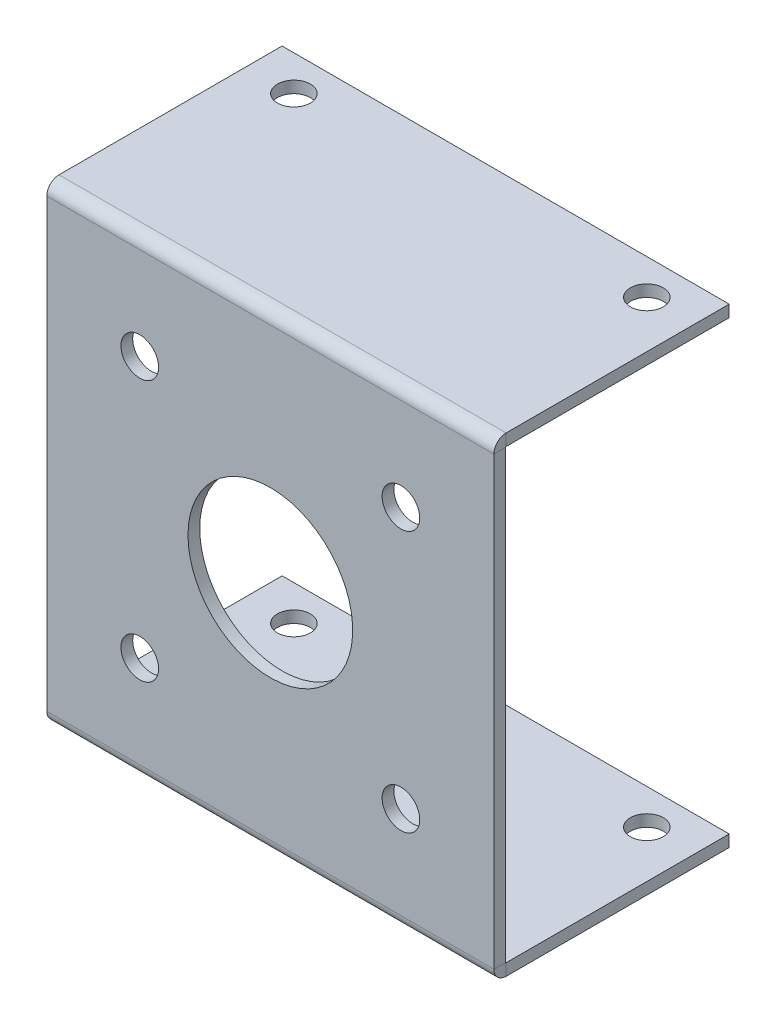
ISO-10303-21;
HEADER;
FILE_DESCRIPTION(('STEP AP214'),'2;1');
FILE_NAME('part.step','',(''),(''),'','','');
FILE_SCHEMA(('AUTOMOTIVE_DESIGN { 1 0 10303 214 1 1 1 1 }'));
ENDSEC;
DATA;
#1=APPLICATION_CONTEXT('core data for automotive mechanical design processes');
#2=APPLICATION_PROTOCOL_DEFINITION('international standard','automotive_design',2000,#1);
#3=PRODUCT_CONTEXT('',#1,'mechanical');
#4=PRODUCT('Part','Part','',(#3));
#5=PRODUCT_RELATED_PRODUCT_CATEGORY('part','',(#4));
#6=PRODUCT_DEFINITION_FORMATION('','',#4);
#7=PRODUCT_DEFINITION_CONTEXT('part definition',#1,'design');
#8=PRODUCT_DEFINITION('design','',#6,#7);
#9=PRODUCT_DEFINITION_SHAPE('','',#8);
#10=(LENGTH_UNIT() NAMED_UNIT(*) SI_UNIT(.MILLI.,.METRE.));
#11=(NAMED_UNIT(*) PLANE_ANGLE_UNIT() SI_UNIT($,.RADIAN.));
#12=(NAMED_UNIT(*) SI_UNIT($,.STERADIAN.) SOLID_ANGLE_UNIT());
#13=UNCERTAINTY_MEASURE_WITH_UNIT(LENGTH_MEASURE(1.E-05),#10,'distance_accuracy_value','');
#14=(GEOMETRIC_REPRESENTATION_CONTEXT(3) GLOBAL_UNCERTAINTY_ASSIGNED_CONTEXT((#13)) GLOBAL_UNIT_ASSIGNED_CONTEXT((#10,
#11,#12)) REPRESENTATION_CONTEXT('',''));
#15=CARTESIAN_POINT('',(0.,0.,0.));
#16=DIRECTION('',(0.,0.,1.));
#17=DIRECTION('',(1.,0.,0.));
#18=AXIS2_PLACEMENT_3D('',#15,#16,#17);
#19=CARTESIAN_POINT('',(0.,0.,-5.));
#20=DIRECTION('',(0.,0.,-1.));
#21=DIRECTION('',(-1.,0.,0.));
#22=AXIS2_PLACEMENT_3D('',#19,#20,#21);
#23=PLANE('',#22);
#24=CARTESIAN_POINT('',(55.5,-55.5,-5.));
#25=DIRECTION('',(0.,0.,-1.));
#26=DIRECTION('',(-1.,0.,0.));
#27=AXIS2_PLACEMENT_3D('',#24,#25,#26);
#28=CIRCLE('',#27,8.00000000000001);
#29=CARTESIAN_POINT('',(47.5,-55.5,-5.));
#30=VERTEX_POINT('',#29);
#31=EDGE_CURVE('E297',#30,#30,#28,.T.);
#32=ORIENTED_EDGE('',*,*,#31,.F.);
#33=EDGE_LOOP('',(#32));
#34=FACE_BOUND('',#33,.T.);
#35=CARTESIAN_POINT('',(-55.5,-55.5,-5.));
#36=DIRECTION('',(0.,0.,-1.));
#37=DIRECTION('',(-1.,0.,0.));
#38=AXIS2_PLACEMENT_3D('',#35,#36,#37);
#39=CIRCLE('',#38,8.);
#40=CARTESIAN_POINT('',(-63.5,-55.5,-5.));
#41=VERTEX_POINT('',#40);
#42=EDGE_CURVE('E310',#41,#41,#39,.T.);
#43=ORIENTED_EDGE('',*,*,#42,.F.);
#44=EDGE_LOOP('',(#43));
#45=FACE_BOUND('',#44,.T.);
#46=CARTESIAN_POINT('',(-55.5,55.5,-5.));
#47=DIRECTION('',(0.,0.,-1.));
#48=DIRECTION('',(-1.,0.,0.));
#49=AXIS2_PLACEMENT_3D('',#46,#47,#48);
#50=CIRCLE('',#49,8.);
#51=CARTESIAN_POINT('',(-63.5,55.5,-5.));
#52=VERTEX_POINT('',#51);
#53=EDGE_CURVE('E306',#52,#52,#50,.T.);
#54=ORIENTED_EDGE('',*,*,#53,.F.);
#55=EDGE_LOOP('',(#54));
#56=FACE_BOUND('',#55,.T.);
#57=CARTESIAN_POINT('',(55.5,55.5,-5.));
#58=DIRECTION('',(0.,0.,-1.));
#59=DIRECTION('',(-1.,0.,0.));
#60=AXIS2_PLACEMENT_3D('',#57,#58,#59);
#61=CIRCLE('',#60,8.00000000000001);
#62=CARTESIAN_POINT('',(47.5,55.5,-5.));
#63=VERTEX_POINT('',#62);
#64=EDGE_CURVE('E301',#63,#63,#61,.T.);
#65=ORIENTED_EDGE('',*,*,#64,.F.);
#66=EDGE_LOOP('',(#65));
#67=FACE_BOUND('',#66,.T.);
#68=CARTESIAN_POINT('',(0.,0.,-5.));
#69=DIRECTION('',(0.,0.,-1.));
#70=DIRECTION('',(-1.,0.,0.));
#71=AXIS2_PLACEMENT_3D('',#68,#69,#70);
#72=CIRCLE('',#71,35.);
#73=CARTESIAN_POINT('',(-35.,0.,-5.));
#74=VERTEX_POINT('',#73);
#75=EDGE_CURVE('E213',#74,#74,#72,.T.);
#76=ORIENTED_EDGE('',*,*,#75,.F.);
#77=EDGE_LOOP('',(#76));
#78=FACE_BOUND('',#77,.T.);
#79=DIRECTION('',(0.,1.,0.));
#80=VECTOR('',#79,1.);
#81=CARTESIAN_POINT('',(95.,-100.,-5.));
#82=LINE('',#81,#80);
#83=CARTESIAN_POINT('',(95.,-94.8,-5.00000000000001));
#84=VERTEX_POINT('',#83);
#85=CARTESIAN_POINT('',(95.,94.8,-5.));
#86=VERTEX_POINT('',#85);
#87=EDGE_CURVE('E88',#84,#86,#82,.T.);
#88=ORIENTED_EDGE('',*,*,#87,.F.);
#89=DIRECTION('',(-1.,0.,0.));
#90=VECTOR('',#89,1.);
#91=CARTESIAN_POINT('',(-95.,-94.8,-5.00000000000001));
#92=LINE('',#91,#90);
#93=CARTESIAN_POINT('',(-95.,-94.8,-5.00000000000001));
#94=VERTEX_POINT('',#93);
#95=EDGE_CURVE('E226',#94,#84,#92,.F.);
#96=ORIENTED_EDGE('',*,*,#95,.F.);
#97=DIRECTION('',(0.,-1.,0.));
#98=VECTOR('',#97,1.);
#99=CARTESIAN_POINT('',(-95.,-100.,-5.));
#100=LINE('',#99,#98);
#101=CARTESIAN_POINT('',(-95.,94.8,-5.));
#102=VERTEX_POINT('',#101);
#103=EDGE_CURVE('E13',#102,#94,#100,.T.);
#104=ORIENTED_EDGE('',*,*,#103,.F.);
#105=DIRECTION('',(1.,0.,0.));
#106=VECTOR('',#105,1.);
#107=CARTESIAN_POINT('',(95.,94.8,-5.00000000000001));
#108=LINE('',#107,#106);
#109=EDGE_CURVE('E282',#86,#102,#108,.F.);
#110=ORIENTED_EDGE('',*,*,#109,.F.);
#111=EDGE_LOOP('',(#88,#96,#104,#110));
#112=FACE_BOUND('',#111,.T.);
#113=ADVANCED_FACE('F79',(#34,#45,#56,#67,#78,#112),#23,.T.);
#114=CARTESIAN_POINT('',(0.,0.,0.));
#115=DIRECTION('',(0.,0.,-1.));
#116=DIRECTION('',(-1.,0.,0.));
#117=AXIS2_PLACEMENT_3D('',#114,#115,#116);
#118=PLANE('',#117);
#119=CARTESIAN_POINT('',(55.5,-55.5,0.));
#120=DIRECTION('',(0.,0.,-1.));
#121=DIRECTION('',(-1.,0.,0.));
#122=AXIS2_PLACEMENT_3D('',#119,#120,#121);
#123=CIRCLE('',#122,8.00000000000001);
#124=CARTESIAN_POINT('',(47.5,-55.5,0.));
#125=VERTEX_POINT('',#124);
#126=EDGE_CURVE('E311',#125,#125,#123,.T.);
#127=ORIENTED_EDGE('',*,*,#126,.T.);
#128=EDGE_LOOP('',(#127));
#129=FACE_BOUND('',#128,.T.);
#130=CARTESIAN_POINT('',(-55.5,-55.5,0.));
#131=DIRECTION('',(0.,0.,-1.));
#132=DIRECTION('',(-1.,0.,0.));
#133=AXIS2_PLACEMENT_3D('',#130,#131,#132);
#134=CIRCLE('',#133,8.);
#135=CARTESIAN_POINT('',(-63.5,-55.5,0.));
#136=VERTEX_POINT('',#135);
#137=EDGE_CURVE('E307',#136,#136,#134,.T.);
#138=ORIENTED_EDGE('',*,*,#137,.T.);
#139=EDGE_LOOP('',(#138));
#140=FACE_BOUND('',#139,.T.);
#141=CARTESIAN_POINT('',(-55.5,55.5,0.));
#142=DIRECTION('',(0.,0.,-1.));
#143=DIRECTION('',(-1.,0.,0.));
#144=AXIS2_PLACEMENT_3D('',#141,#142,#143);
#145=CIRCLE('',#144,8.);
#146=CARTESIAN_POINT('',(-63.5,55.5,0.));
#147=VERTEX_POINT('',#146);
#148=EDGE_CURVE('E303',#147,#147,#145,.T.);
#149=ORIENTED_EDGE('',*,*,#148,.T.);
#150=EDGE_LOOP('',(#149));
#151=FACE_BOUND('',#150,.T.);
#152=CARTESIAN_POINT('',(55.5,55.5,0.));
#153=DIRECTION('',(0.,0.,-1.));
#154=DIRECTION('',(-1.,0.,0.));
#155=AXIS2_PLACEMENT_3D('',#152,#153,#154);
#156=CIRCLE('',#155,8.00000000000001);
#157=CARTESIAN_POINT('',(47.5,55.5,0.));
#158=VERTEX_POINT('',#157);
#159=EDGE_CURVE('E298',#158,#158,#156,.T.);
#160=ORIENTED_EDGE('',*,*,#159,.T.);
#161=EDGE_LOOP('',(#160));
#162=FACE_BOUND('',#161,.T.);
#163=CARTESIAN_POINT('',(0.,0.,0.));
#164=DIRECTION('',(0.,0.,-1.));
#165=DIRECTION('',(-1.,0.,0.));
#166=AXIS2_PLACEMENT_3D('',#163,#164,#165);
#167=CIRCLE('',#166,35.);
#168=CARTESIAN_POINT('',(-35.,0.,0.));
#169=VERTEX_POINT('',#168);
#170=EDGE_CURVE('E294',#169,#169,#167,.T.);
#171=ORIENTED_EDGE('',*,*,#170,.T.);
#172=EDGE_LOOP('',(#171));
#173=FACE_BOUND('',#172,.T.);
#174=DIRECTION('',(-1.,0.,0.));
#175=VECTOR('',#174,1.);
#176=CARTESIAN_POINT('',(-95.,-94.8,0.));
#177=LINE('',#176,#175);
#178=CARTESIAN_POINT('',(-95.,-94.8,0.));
#179=VERTEX_POINT('',#178);
#180=CARTESIAN_POINT('',(95.,-94.8,0.));
#181=VERTEX_POINT('',#180);
#182=EDGE_CURVE('E214',#179,#181,#177,.F.);
#183=ORIENTED_EDGE('',*,*,#182,.T.);
#184=DIRECTION('',(0.,1.,0.));
#185=VECTOR('',#184,1.);
#186=CARTESIAN_POINT('',(95.,-100.,0.));
#187=LINE('',#186,#185);
#188=CARTESIAN_POINT('',(95.,94.8,0.));
#189=VERTEX_POINT('',#188);
#190=EDGE_CURVE('E288',#181,#189,#187,.T.);
#191=ORIENTED_EDGE('',*,*,#190,.T.);
#192=DIRECTION('',(1.,0.,0.));
#193=VECTOR('',#192,1.);
#194=CARTESIAN_POINT('',(95.,94.8,0.));
#195=LINE('',#194,#193);
#196=CARTESIAN_POINT('',(-95.,94.8,0.));
#197=VERTEX_POINT('',#196);
#198=EDGE_CURVE('E270',#189,#197,#195,.F.);
#199=ORIENTED_EDGE('',*,*,#198,.T.);
#200=DIRECTION('',(0.,-1.,0.));
#201=VECTOR('',#200,1.);
#202=CARTESIAN_POINT('',(-95.,-100.,0.));
#203=LINE('',#202,#201);
#204=EDGE_CURVE('E290',#197,#179,#203,.T.);
#205=ORIENTED_EDGE('',*,*,#204,.T.);
#206=EDGE_LOOP('',(#183,#191,#199,#205));
#207=FACE_BOUND('',#206,.T.);
#208=ADVANCED_FACE('F372',(#129,#140,#151,#162,#173,#207),#118,.F.);
#209=CARTESIAN_POINT('',(-95.,-100.,-5.));
#210=DIRECTION('',(-1.,0.,0.));
#211=DIRECTION('',(0.,0.,1.));
#212=AXIS2_PLACEMENT_3D('',#209,#210,#211);
#213=PLANE('',#212);
#214=ORIENTED_EDGE('',*,*,#103,.T.);
#215=DIRECTION('',(0.,0.,1.));
#216=VECTOR('',#215,1.);
#217=CARTESIAN_POINT('',(-95.,-94.8,-5.00000000000001));
#218=LINE('',#217,#216);
#219=EDGE_CURVE('E220',#94,#179,#218,.T.);
#220=ORIENTED_EDGE('',*,*,#219,.T.);
#221=ORIENTED_EDGE('',*,*,#204,.F.);
#222=DIRECTION('',(0.,0.,1.));
#223=VECTOR('',#222,1.);
#224=CARTESIAN_POINT('',(-95.,94.8,-5.00000000000001));
#225=LINE('',#224,#223);
#226=EDGE_CURVE('E95',#102,#197,#225,.T.);
#227=ORIENTED_EDGE('',*,*,#226,.F.);
#228=EDGE_LOOP('',(#214,#220,#221,#227));
#229=FACE_BOUND('',#228,.T.);
#230=ADVANCED_FACE('F378',(#229),#213,.T.);
#231=CARTESIAN_POINT('',(95.,-100.,-5.));
#232=DIRECTION('',(1.,0.,0.));
#233=DIRECTION('',(0.,0.,-1.));
#234=AXIS2_PLACEMENT_3D('',#231,#232,#233);
#235=PLANE('',#234);
#236=DIRECTION('',(0.,0.,1.));
#237=VECTOR('',#236,1.);
#238=CARTESIAN_POINT('',(95.,-94.8,-5.00000000000001));
#239=LINE('',#238,#237);
#240=EDGE_CURVE('E232',#84,#181,#239,.T.);
#241=ORIENTED_EDGE('',*,*,#240,.F.);
#242=ORIENTED_EDGE('',*,*,#87,.T.);
#243=DIRECTION('',(0.,0.,1.));
#244=VECTOR('',#243,1.);
#245=CARTESIAN_POINT('',(95.,94.8,-5.00000000000001));
#246=LINE('',#245,#244);
#247=EDGE_CURVE('E276',#86,#189,#246,.T.);
#248=ORIENTED_EDGE('',*,*,#247,.T.);
#249=ORIENTED_EDGE('',*,*,#190,.F.);
#250=EDGE_LOOP('',(#241,#242,#248,#249));
#251=FACE_BOUND('',#250,.T.);
#252=ADVANCED_FACE('F81',(#251),#235,.T.);
#253=CARTESIAN_POINT('',(-95.,94.8,-5.20000000000001));
#254=DIRECTION('',(-1.,0.,0.));
#255=DIRECTION('',(0.,0.,1.));
#256=AXIS2_PLACEMENT_3D('',#253,#254,#255);
#257=PLANE('',#256);
#258=DIRECTION('',(0.,1.,0.));
#259=VECTOR('',#258,1.);
#260=CARTESIAN_POINT('',(-95.,100.,-5.2));
#261=LINE('',#260,#259);
#262=CARTESIAN_POINT('',(-95.,95.,-5.20000000000001));
#263=VERTEX_POINT('',#262);
#264=CARTESIAN_POINT('',(-95.,100.,-5.19999999999999));
#265=VERTEX_POINT('',#264);
#266=EDGE_CURVE('E235',#263,#265,#261,.T.);
#267=ORIENTED_EDGE('',*,*,#266,.F.);
#268=CARTESIAN_POINT('',(-95.,94.8,-5.20000000000001));
#269=DIRECTION('',(1.,0.,0.));
#270=DIRECTION('',(0.,0.,-1.));
#271=AXIS2_PLACEMENT_3D('',#268,#269,#270);
#272=CIRCLE('',#271,0.200000000000006);
#273=EDGE_CURVE('E279',#102,#263,#272,.F.);
#274=ORIENTED_EDGE('',*,*,#273,.F.);
#275=ORIENTED_EDGE('',*,*,#226,.T.);
#276=CARTESIAN_POINT('',(-95.,94.8,-5.20000000000001));
#277=DIRECTION('',(1.,0.,0.));
#278=DIRECTION('',(0.,0.,-1.));
#279=AXIS2_PLACEMENT_3D('',#276,#277,#278);
#280=CIRCLE('',#279,5.20000000000001);
#281=EDGE_CURVE('E272',#197,#265,#280,.F.);
#282=ORIENTED_EDGE('',*,*,#281,.T.);
#283=EDGE_LOOP('',(#267,#274,#275,#282));
#284=FACE_BOUND('',#283,.T.);
#285=ADVANCED_FACE('F390',(#284),#257,.T.);
#286=CARTESIAN_POINT('',(95.,94.8,-5.20000000000001));
#287=DIRECTION('',(-1.,0.,0.));
#288=DIRECTION('',(0.,0.,1.));
#289=AXIS2_PLACEMENT_3D('',#286,#287,#288);
#290=PLANE('',#289);
#291=CARTESIAN_POINT('',(95.,94.8,-5.20000000000001));
#292=DIRECTION('',(1.,0.,0.));
#293=DIRECTION('',(0.,0.,-1.));
#294=AXIS2_PLACEMENT_3D('',#291,#292,#293);
#295=CIRCLE('',#294,0.200000000000006);
#296=CARTESIAN_POINT('',(95.,95.,-5.20000000000001));
#297=VERTEX_POINT('',#296);
#298=EDGE_CURVE('E240',#297,#86,#295,.T.);
#299=ORIENTED_EDGE('',*,*,#298,.F.);
#300=DIRECTION('',(0.,1.,0.));
#301=VECTOR('',#300,1.);
#302=CARTESIAN_POINT('',(95.,95.,-5.20000000000001));
#303=LINE('',#302,#301);
#304=CARTESIAN_POINT('',(95.,100.,-5.19999999999999));
#305=VERTEX_POINT('',#304);
#306=EDGE_CURVE('E263',#297,#305,#303,.T.);
#307=ORIENTED_EDGE('',*,*,#306,.T.);
#308=CARTESIAN_POINT('',(95.,94.8,-5.20000000000001));
#309=DIRECTION('',(1.,0.,0.));
#310=DIRECTION('',(0.,0.,-1.));
#311=AXIS2_PLACEMENT_3D('',#308,#309,#310);
#312=CIRCLE('',#311,5.20000000000001);
#313=EDGE_CURVE('E273',#305,#189,#312,.T.);
#314=ORIENTED_EDGE('',*,*,#313,.T.);
#315=ORIENTED_EDGE('',*,*,#247,.F.);
#316=EDGE_LOOP('',(#299,#307,#314,#315));
#317=FACE_BOUND('',#316,.T.);
#318=ADVANCED_FACE('F384',(#317),#290,.F.);
#319=CARTESIAN_POINT('',(95.,94.8,-5.20000000000001));
#320=DIRECTION('',(1.,0.,0.));
#321=DIRECTION('',(0.,1.,0.));
#322=AXIS2_PLACEMENT_3D('',#319,#320,#321);
#323=CYLINDRICAL_SURFACE('',#322,5.20000000000001);
#324=ORIENTED_EDGE('',*,*,#198,.F.);
#325=ORIENTED_EDGE('',*,*,#313,.F.);
#326=DIRECTION('',(1.,0.,0.));
#327=VECTOR('',#326,1.);
#328=CARTESIAN_POINT('',(0.,100.,-5.19999999999999));
#329=LINE('',#328,#327);
#330=EDGE_CURVE('E260',#265,#305,#329,.T.);
#331=ORIENTED_EDGE('',*,*,#330,.F.);
#332=ORIENTED_EDGE('',*,*,#281,.F.);
#333=EDGE_LOOP('',(#324,#325,#331,#332));
#334=FACE_BOUND('',#333,.T.);
#335=ADVANCED_FACE('F423',(#334),#323,.T.);
#336=CARTESIAN_POINT('',(95.,94.8,-5.20000000000001));
#337=DIRECTION('',(1.,0.,0.));
#338=DIRECTION('',(0.,1.,0.));
#339=AXIS2_PLACEMENT_3D('',#336,#337,#338);
#340=CYLINDRICAL_SURFACE('',#339,0.200000000000006);
#341=ORIENTED_EDGE('',*,*,#109,.T.);
#342=ORIENTED_EDGE('',*,*,#273,.T.);
#343=DIRECTION('',(-1.,0.,0.));
#344=VECTOR('',#343,1.);
#345=CARTESIAN_POINT('',(-95.,95.,-5.20000000000001));
#346=LINE('',#345,#344);
#347=EDGE_CURVE('E266',#263,#297,#346,.F.);
#348=ORIENTED_EDGE('',*,*,#347,.T.);
#349=ORIENTED_EDGE('',*,*,#298,.T.);
#350=EDGE_LOOP('',(#341,#342,#348,#349));
#351=FACE_BOUND('',#350,.T.);
#352=ADVANCED_FACE('F396',(#351),#340,.F.);
#353=CARTESIAN_POINT('',(95.,100.,-4.99999999999998));
#354=DIRECTION('',(1.,0.,0.));
#355=DIRECTION('',(0.,0.,-1.));
#356=AXIS2_PLACEMENT_3D('',#353,#354,#355);
#357=PLANE('',#356);
#358=DIRECTION('',(0.,0.,1.));
#359=VECTOR('',#358,1.);
#360=CARTESIAN_POINT('',(95.,100.,-4.99999999999998));
#361=LINE('',#360,#359);
#362=CARTESIAN_POINT('',(95.,100.,-100.));
#363=VERTEX_POINT('',#362);
#364=EDGE_CURVE('E244',#363,#305,#361,.T.);
#365=ORIENTED_EDGE('',*,*,#364,.T.);
#366=ORIENTED_EDGE('',*,*,#306,.F.);
#367=DIRECTION('',(0.,0.,-1.));
#368=VECTOR('',#367,1.);
#369=CARTESIAN_POINT('',(95.,95.,3.5059674461847E-13));
#370=LINE('',#369,#368);
#371=CARTESIAN_POINT('',(95.,95.0000000000003,-100.));
#372=VERTEX_POINT('',#371);
#373=EDGE_CURVE('E252',#372,#297,#370,.F.);
#374=ORIENTED_EDGE('',*,*,#373,.F.);
#375=DIRECTION('',(0.,-1.,0.));
#376=VECTOR('',#375,1.);
#377=CARTESIAN_POINT('',(95.,100.,-100.));
#378=LINE('',#377,#376);
#379=EDGE_CURVE('E238',#363,#372,#378,.T.);
#380=ORIENTED_EDGE('',*,*,#379,.F.);
#381=EDGE_LOOP('',(#365,#366,#374,#380));
#382=FACE_BOUND('',#381,.T.);
#383=ADVANCED_FACE('F418',(#382),#357,.T.);
#384=CARTESIAN_POINT('',(-95.,100.,-100.));
#385=DIRECTION('',(-1.,0.,0.));
#386=DIRECTION('',(0.,0.,1.));
#387=AXIS2_PLACEMENT_3D('',#384,#385,#386);
#388=PLANE('',#387);
#389=DIRECTION('',(0.,0.,1.));
#390=VECTOR('',#389,1.);
#391=CARTESIAN_POINT('',(-95.,95.,3.5059674461847E-13));
#392=LINE('',#391,#390);
#393=CARTESIAN_POINT('',(-95.,95.0000000000003,-100.));
#394=VERTEX_POINT('',#393);
#395=EDGE_CURVE('E258',#263,#394,#392,.F.);
#396=ORIENTED_EDGE('',*,*,#395,.F.);
#397=ORIENTED_EDGE('',*,*,#266,.T.);
#398=DIRECTION('',(0.,0.,-1.));
#399=VECTOR('',#398,1.);
#400=CARTESIAN_POINT('',(-95.,100.,-100.));
#401=LINE('',#400,#399);
#402=CARTESIAN_POINT('',(-95.,100.,-100.));
#403=VERTEX_POINT('',#402);
#404=EDGE_CURVE('E250',#265,#403,#401,.T.);
#405=ORIENTED_EDGE('',*,*,#404,.T.);
#406=DIRECTION('',(0.,-1.,0.));
#407=VECTOR('',#406,1.);
#408=CARTESIAN_POINT('',(-95.,100.,-100.));
#409=LINE('',#408,#407);
#410=EDGE_CURVE('E241',#403,#394,#409,.T.);
#411=ORIENTED_EDGE('',*,*,#410,.T.);
#412=EDGE_LOOP('',(#396,#397,#405,#411));
#413=FACE_BOUND('',#412,.T.);
#414=ADVANCED_FACE('F404',(#413),#388,.T.);
#415=CARTESIAN_POINT('',(0.,100.,3.68054151312686E-13));
#416=DIRECTION('',(0.,1.,0.));
#417=DIRECTION('',(0.,0.,1.));
#418=AXIS2_PLACEMENT_3D('',#415,#416,#417);
#419=PLANE('',#418);
#420=CARTESIAN_POINT('',(-75.,100.,-85.0000000000007));
#421=DIRECTION('',(0.,-1.,0.));
#422=DIRECTION('',(0.,0.,-1.));
#423=AXIS2_PLACEMENT_3D('',#420,#421,#422);
#424=CIRCLE('',#423,7.);
#425=CARTESIAN_POINT('',(-75.,100.,-92.0000000000007));
#426=VERTEX_POINT('',#425);
#427=EDGE_CURVE('E316',#426,#426,#424,.T.);
#428=ORIENTED_EDGE('',*,*,#427,.T.);
#429=EDGE_LOOP('',(#428));
#430=FACE_BOUND('',#429,.T.);
#431=CARTESIAN_POINT('',(75.,100.,-85.0000000000007));
#432=DIRECTION('',(0.,-1.,0.));
#433=DIRECTION('',(0.,0.,-1.));
#434=AXIS2_PLACEMENT_3D('',#431,#432,#433);
#435=CIRCLE('',#434,7.);
#436=CARTESIAN_POINT('',(75.,100.,-92.0000000000007));
#437=VERTEX_POINT('',#436);
#438=EDGE_CURVE('E323',#437,#437,#435,.T.);
#439=ORIENTED_EDGE('',*,*,#438,.T.);
#440=EDGE_LOOP('',(#439));
#441=FACE_BOUND('',#440,.T.);
#442=ORIENTED_EDGE('',*,*,#404,.F.);
#443=ORIENTED_EDGE('',*,*,#330,.T.);
#444=ORIENTED_EDGE('',*,*,#364,.F.);
#445=DIRECTION('',(1.,0.,0.));
#446=VECTOR('',#445,1.);
#447=CARTESIAN_POINT('',(95.,100.,-100.));
#448=LINE('',#447,#446);
#449=EDGE_CURVE('E247',#403,#363,#448,.T.);
#450=ORIENTED_EDGE('',*,*,#449,.F.);
#451=EDGE_LOOP('',(#442,#443,#444,#450));
#452=FACE_BOUND('',#451,.T.);
#453=ADVANCED_FACE('F408',(#430,#441,#452),#419,.T.);
#454=CARTESIAN_POINT('',(0.,95.,3.5059674461847E-13));
#455=DIRECTION('',(0.,1.,0.));
#456=DIRECTION('',(0.,0.,1.));
#457=AXIS2_PLACEMENT_3D('',#454,#455,#456);
#458=PLANE('',#457);
#459=CARTESIAN_POINT('',(-75.,95.0000000000003,-85.0000000000007));
#460=DIRECTION('',(0.,1.,0.));
#461=DIRECTION('',(0.,0.,1.));
#462=AXIS2_PLACEMENT_3D('',#459,#460,#461);
#463=CIRCLE('',#462,7.);
#464=CARTESIAN_POINT('',(-75.,95.0000000000003,-78.0000000000007));
#465=VERTEX_POINT('',#464);
#466=EDGE_CURVE('E302',#465,#465,#463,.T.);
#467=ORIENTED_EDGE('',*,*,#466,.T.);
#468=EDGE_LOOP('',(#467));
#469=FACE_BOUND('',#468,.T.);
#470=CARTESIAN_POINT('',(75.,95.0000000000003,-85.0000000000007));
#471=DIRECTION('',(0.,1.,0.));
#472=DIRECTION('',(0.,0.,1.));
#473=AXIS2_PLACEMENT_3D('',#470,#471,#472);
#474=CIRCLE('',#473,7.);
#475=CARTESIAN_POINT('',(75.,95.0000000000003,-78.0000000000007));
#476=VERTEX_POINT('',#475);
#477=EDGE_CURVE('E320',#476,#476,#474,.T.);
#478=ORIENTED_EDGE('',*,*,#477,.T.);
#479=EDGE_LOOP('',(#478));
#480=FACE_BOUND('',#479,.T.);
#481=ORIENTED_EDGE('',*,*,#347,.F.);
#482=ORIENTED_EDGE('',*,*,#395,.T.);
#483=DIRECTION('',(-1.,0.,0.));
#484=VECTOR('',#483,1.);
#485=CARTESIAN_POINT('',(0.,95.0000000000003,-100.));
#486=LINE('',#485,#484);
#487=EDGE_CURVE('E255',#394,#372,#486,.F.);
#488=ORIENTED_EDGE('',*,*,#487,.T.);
#489=ORIENTED_EDGE('',*,*,#373,.T.);
#490=EDGE_LOOP('',(#481,#482,#488,#489));
#491=FACE_BOUND('',#490,.T.);
#492=ADVANCED_FACE('F415',(#469,#480,#491),#458,.F.);
#493=CARTESIAN_POINT('',(95.,100.,-100.));
#494=DIRECTION('',(0.,0.,-1.));
#495=DIRECTION('',(0.,1.,0.));
#496=AXIS2_PLACEMENT_3D('',#493,#494,#495);
#497=PLANE('',#496);
#498=ORIENTED_EDGE('',*,*,#487,.F.);
#499=ORIENTED_EDGE('',*,*,#410,.F.);
#500=ORIENTED_EDGE('',*,*,#449,.T.);
#501=ORIENTED_EDGE('',*,*,#379,.T.);
#502=EDGE_LOOP('',(#498,#499,#500,#501));
#503=FACE_BOUND('',#502,.T.);
#504=ADVANCED_FACE('F412',(#503),#497,.T.);
#505=CARTESIAN_POINT('',(95.,-94.8,-5.20000000000001));
#506=DIRECTION('',(1.,0.,0.));
#507=DIRECTION('',(0.,0.,-1.));
#508=AXIS2_PLACEMENT_3D('',#505,#506,#507);
#509=PLANE('',#508);
#510=DIRECTION('',(0.,1.,0.));
#511=VECTOR('',#510,1.);
#512=CARTESIAN_POINT('',(95.,-100.,-5.19999999999999));
#513=LINE('',#512,#511);
#514=CARTESIAN_POINT('',(95.,-95.,-5.20000000000001));
#515=VERTEX_POINT('',#514);
#516=CARTESIAN_POINT('',(95.,-100.,-5.19999999999999));
#517=VERTEX_POINT('',#516);
#518=EDGE_CURVE('E195',#515,#517,#513,.F.);
#519=ORIENTED_EDGE('',*,*,#518,.F.);
#520=CARTESIAN_POINT('',(95.,-94.8,-5.20000000000001));
#521=DIRECTION('',(-1.,0.,0.));
#522=DIRECTION('',(0.,0.,1.));
#523=AXIS2_PLACEMENT_3D('',#520,#521,#522);
#524=CIRCLE('',#523,0.200000000000006);
#525=EDGE_CURVE('E223',#84,#515,#524,.F.);
#526=ORIENTED_EDGE('',*,*,#525,.F.);
#527=ORIENTED_EDGE('',*,*,#240,.T.);
#528=CARTESIAN_POINT('',(95.,-94.8,-5.20000000000001));
#529=DIRECTION('',(-1.,0.,0.));
#530=DIRECTION('',(0.,0.,1.));
#531=AXIS2_PLACEMENT_3D('',#528,#529,#530);
#532=CIRCLE('',#531,5.20000000000001);
#533=EDGE_CURVE('E216',#181,#517,#532,.F.);
#534=ORIENTED_EDGE('',*,*,#533,.T.);
#535=EDGE_LOOP('',(#519,#526,#527,#534));
#536=FACE_BOUND('',#535,.T.);
#537=ADVANCED_FACE('F428',(#536),#509,.T.);
#538=CARTESIAN_POINT('',(-95.,-94.8,-5.20000000000001));
#539=DIRECTION('',(1.,0.,0.));
#540=DIRECTION('',(0.,0.,-1.));
#541=AXIS2_PLACEMENT_3D('',#538,#539,#540);
#542=PLANE('',#541);
#543=CARTESIAN_POINT('',(-95.,-94.8,-5.20000000000001));
#544=DIRECTION('',(-1.,0.,0.));
#545=DIRECTION('',(0.,0.,1.));
#546=AXIS2_PLACEMENT_3D('',#543,#544,#545);
#547=CIRCLE('',#546,0.200000000000006);
#548=CARTESIAN_POINT('',(-95.,-95.,-5.20000000000001));
#549=VERTEX_POINT('',#548);
#550=EDGE_CURVE('E229',#549,#94,#547,.T.);
#551=ORIENTED_EDGE('',*,*,#550,.F.);
#552=DIRECTION('',(0.,1.,0.));
#553=VECTOR('',#552,1.);
#554=CARTESIAN_POINT('',(-95.,-95.,-5.20000000000001));
#555=LINE('',#554,#553);
#556=CARTESIAN_POINT('',(-95.,-100.,-5.19999999999999));
#557=VERTEX_POINT('',#556);
#558=EDGE_CURVE('E207',#549,#557,#555,.F.);
#559=ORIENTED_EDGE('',*,*,#558,.T.);
#560=CARTESIAN_POINT('',(-95.,-94.8,-5.20000000000001));
#561=DIRECTION('',(-1.,0.,0.));
#562=DIRECTION('',(0.,0.,1.));
#563=AXIS2_PLACEMENT_3D('',#560,#561,#562);
#564=CIRCLE('',#563,5.20000000000001);
#565=EDGE_CURVE('E217',#557,#179,#564,.T.);
#566=ORIENTED_EDGE('',*,*,#565,.T.);
#567=ORIENTED_EDGE('',*,*,#219,.F.);
#568=EDGE_LOOP('',(#551,#559,#566,#567));
#569=FACE_BOUND('',#568,.T.);
#570=ADVANCED_FACE('F358',(#569),#542,.F.);
#571=CARTESIAN_POINT('',(-95.,-94.8,-5.20000000000001));
#572=DIRECTION('',(-1.,0.,0.));
#573=DIRECTION('',(0.,-1.,0.));
#574=AXIS2_PLACEMENT_3D('',#571,#572,#573);
#575=CYLINDRICAL_SURFACE('',#574,5.20000000000001);
#576=ORIENTED_EDGE('',*,*,#182,.F.);
#577=ORIENTED_EDGE('',*,*,#565,.F.);
#578=DIRECTION('',(-1.,0.,0.));
#579=VECTOR('',#578,1.);
#580=CARTESIAN_POINT('',(95.,-100.,-5.19999999999999));
#581=LINE('',#580,#579);
#582=EDGE_CURVE('E205',#557,#517,#581,.F.);
#583=ORIENTED_EDGE('',*,*,#582,.T.);
#584=ORIENTED_EDGE('',*,*,#533,.F.);
#585=EDGE_LOOP('',(#576,#577,#583,#584));
#586=FACE_BOUND('',#585,.T.);
#587=ADVANCED_FACE('F367',(#586),#575,.T.);
#588=CARTESIAN_POINT('',(-95.,-94.8,-5.20000000000001));
#589=DIRECTION('',(-1.,0.,0.));
#590=DIRECTION('',(0.,-1.,0.));
#591=AXIS2_PLACEMENT_3D('',#588,#589,#590);
#592=CYLINDRICAL_SURFACE('',#591,0.200000000000006);
#593=ORIENTED_EDGE('',*,*,#95,.T.);
#594=ORIENTED_EDGE('',*,*,#525,.T.);
#595=DIRECTION('',(-1.,0.,0.));
#596=VECTOR('',#595,1.);
#597=CARTESIAN_POINT('',(95.,-95.,-5.20000000000001));
#598=LINE('',#597,#596);
#599=EDGE_CURVE('E210',#515,#549,#598,.T.);
#600=ORIENTED_EDGE('',*,*,#599,.T.);
#601=ORIENTED_EDGE('',*,*,#550,.T.);
#602=EDGE_LOOP('',(#593,#594,#600,#601));
#603=FACE_BOUND('',#602,.T.);
#604=ADVANCED_FACE('F353',(#603),#592,.F.);
#605=CARTESIAN_POINT('',(-95.,-100.,-100.));
#606=DIRECTION('',(1.,0.,0.));
#607=DIRECTION('',(0.,0.,-1.));
#608=AXIS2_PLACEMENT_3D('',#605,#606,#607);
#609=PLANE('',#608);
#610=ORIENTED_EDGE('',*,*,#558,.F.);
#611=DIRECTION('',(0.,0.,1.));
#612=VECTOR('',#611,1.);
#613=CARTESIAN_POINT('',(-95.,-95.0000000000003,-100.));
#614=LINE('',#613,#612);
#615=CARTESIAN_POINT('',(-95.,-95.0000000000003,-100.));
#616=VERTEX_POINT('',#615);
#617=EDGE_CURVE('E203',#549,#616,#614,.F.);
#618=ORIENTED_EDGE('',*,*,#617,.T.);
#619=DIRECTION('',(0.,1.,0.));
#620=VECTOR('',#619,1.);
#621=CARTESIAN_POINT('',(-95.,-100.,-100.));
#622=LINE('',#621,#620);
#623=CARTESIAN_POINT('',(-95.,-100.,-100.));
#624=VERTEX_POINT('',#623);
#625=EDGE_CURVE('E191',#624,#616,#622,.T.);
#626=ORIENTED_EDGE('',*,*,#625,.F.);
#627=DIRECTION('',(0.,0.,-1.));
#628=VECTOR('',#627,1.);
#629=CARTESIAN_POINT('',(-95.,-100.,3.68054151312686E-13));
#630=LINE('',#629,#628);
#631=EDGE_CURVE('E178',#557,#624,#630,.T.);
#632=ORIENTED_EDGE('',*,*,#631,.F.);
#633=EDGE_LOOP('',(#610,#618,#626,#632));
#634=FACE_BOUND('',#633,.T.);
#635=ADVANCED_FACE('F359',(#634),#609,.F.);
#636=CARTESIAN_POINT('',(95.,-100.,-4.99999999999998));
#637=DIRECTION('',(-1.,0.,0.));
#638=DIRECTION('',(0.,0.,1.));
#639=AXIS2_PLACEMENT_3D('',#636,#637,#638);
#640=PLANE('',#639);
#641=ORIENTED_EDGE('',*,*,#518,.T.);
#642=DIRECTION('',(0.,0.,1.));
#643=VECTOR('',#642,1.);
#644=CARTESIAN_POINT('',(95.,-100.,3.68054151312686E-13));
#645=LINE('',#644,#643);
#646=CARTESIAN_POINT('',(95.,-100.,-100.));
#647=VERTEX_POINT('',#646);
#648=EDGE_CURVE('E176',#647,#517,#645,.T.);
#649=ORIENTED_EDGE('',*,*,#648,.F.);
#650=DIRECTION('',(0.,1.,0.));
#651=VECTOR('',#650,1.);
#652=CARTESIAN_POINT('',(95.,-100.,-100.));
#653=LINE('',#652,#651);
#654=CARTESIAN_POINT('',(95.,-95.0000000000003,-100.));
#655=VERTEX_POINT('',#654);
#656=EDGE_CURVE('E184',#647,#655,#653,.T.);
#657=ORIENTED_EDGE('',*,*,#656,.T.);
#658=DIRECTION('',(0.,0.,-1.));
#659=VECTOR('',#658,1.);
#660=CARTESIAN_POINT('',(95.,-95.,-5.));
#661=LINE('',#660,#659);
#662=EDGE_CURVE('E200',#655,#515,#661,.F.);
#663=ORIENTED_EDGE('',*,*,#662,.T.);
#664=EDGE_LOOP('',(#641,#649,#657,#663));
#665=FACE_BOUND('',#664,.T.);
#666=ADVANCED_FACE('F194',(#665),#640,.F.);
#667=CARTESIAN_POINT('',(0.,-100.,3.68054151312686E-13));
#668=DIRECTION('',(0.,1.,0.));
#669=DIRECTION('',(0.,0.,1.));
#670=AXIS2_PLACEMENT_3D('',#667,#668,#669);
#671=PLANE('',#670);
#672=CARTESIAN_POINT('',(-75.,-100.,-85.));
#673=DIRECTION('',(0.,1.,0.));
#674=DIRECTION('',(0.,0.,1.));
#675=AXIS2_PLACEMENT_3D('',#672,#673,#674);
#676=CIRCLE('',#675,7.);
#677=CARTESIAN_POINT('',(-75.,-100.,-78.));
#678=VERTEX_POINT('',#677);
#679=EDGE_CURVE('E332',#678,#678,#676,.T.);
#680=ORIENTED_EDGE('',*,*,#679,.T.);
#681=EDGE_LOOP('',(#680));
#682=FACE_BOUND('',#681,.T.);
#683=CARTESIAN_POINT('',(75.,-100.,-85.));
#684=DIRECTION('',(0.,1.,0.));
#685=DIRECTION('',(0.,0.,1.));
#686=AXIS2_PLACEMENT_3D('',#683,#684,#685);
#687=CIRCLE('',#686,7.);
#688=CARTESIAN_POINT('',(75.,-100.,-78.));
#689=VERTEX_POINT('',#688);
#690=EDGE_CURVE('E315',#689,#689,#687,.T.);
#691=ORIENTED_EDGE('',*,*,#690,.T.);
#692=EDGE_LOOP('',(#691));
#693=FACE_BOUND('',#692,.T.);
#694=ORIENTED_EDGE('',*,*,#582,.F.);
#695=ORIENTED_EDGE('',*,*,#631,.T.);
#696=DIRECTION('',(1.,0.,0.));
#697=VECTOR('',#696,1.);
#698=CARTESIAN_POINT('',(0.,-100.,-100.));
#699=LINE('',#698,#697);
#700=EDGE_CURVE('E171',#624,#647,#699,.T.);
#701=ORIENTED_EDGE('',*,*,#700,.T.);
#702=ORIENTED_EDGE('',*,*,#648,.T.);
#703=EDGE_LOOP('',(#694,#695,#701,#702));
#704=FACE_BOUND('',#703,.T.);
#705=ADVANCED_FACE('F174',(#682,#693,#704),#671,.F.);
#706=CARTESIAN_POINT('',(0.,-95.,3.5059674461847E-13));
#707=DIRECTION('',(0.,1.,0.));
#708=DIRECTION('',(0.,0.,1.));
#709=AXIS2_PLACEMENT_3D('',#706,#707,#708);
#710=PLANE('',#709);
#711=CARTESIAN_POINT('',(-75.,-95.0000000000003,-85.));
#712=DIRECTION('',(0.,1.,0.));
#713=DIRECTION('',(0.,0.,1.));
#714=AXIS2_PLACEMENT_3D('',#711,#712,#713);
#715=CIRCLE('',#714,7.);
#716=CARTESIAN_POINT('',(-75.,-95.0000000000003,-78.));
#717=VERTEX_POINT('',#716);
#718=EDGE_CURVE('E83',#717,#717,#715,.T.);
#719=ORIENTED_EDGE('',*,*,#718,.F.);
#720=EDGE_LOOP('',(#719));
#721=FACE_BOUND('',#720,.T.);
#722=CARTESIAN_POINT('',(75.,-95.0000000000003,-85.));
#723=DIRECTION('',(0.,1.,0.));
#724=DIRECTION('',(0.,0.,1.));
#725=AXIS2_PLACEMENT_3D('',#722,#723,#724);
#726=CIRCLE('',#725,7.);
#727=CARTESIAN_POINT('',(75.,-95.0000000000003,-78.));
#728=VERTEX_POINT('',#727);
#729=EDGE_CURVE('E313',#728,#728,#726,.T.);
#730=ORIENTED_EDGE('',*,*,#729,.F.);
#731=EDGE_LOOP('',(#730));
#732=FACE_BOUND('',#731,.T.);
#733=ORIENTED_EDGE('',*,*,#617,.F.);
#734=ORIENTED_EDGE('',*,*,#599,.F.);
#735=ORIENTED_EDGE('',*,*,#662,.F.);
#736=DIRECTION('',(-1.,0.,0.));
#737=VECTOR('',#736,1.);
#738=CARTESIAN_POINT('',(95.,-95.0000000000003,-100.));
#739=LINE('',#738,#737);
#740=EDGE_CURVE('E187',#616,#655,#739,.F.);
#741=ORIENTED_EDGE('',*,*,#740,.F.);
#742=EDGE_LOOP('',(#733,#734,#735,#741));
#743=FACE_BOUND('',#742,.T.);
#744=ADVANCED_FACE('F349',(#721,#732,#743),#710,.T.);
#745=CARTESIAN_POINT('',(95.,-100.,-100.));
#746=DIRECTION('',(0.,0.,1.));
#747=DIRECTION('',(0.,-1.,0.));
#748=AXIS2_PLACEMENT_3D('',#745,#746,#747);
#749=PLANE('',#748);
#750=ORIENTED_EDGE('',*,*,#740,.T.);
#751=ORIENTED_EDGE('',*,*,#656,.F.);
#752=ORIENTED_EDGE('',*,*,#700,.F.);
#753=ORIENTED_EDGE('',*,*,#625,.T.);
#754=EDGE_LOOP('',(#750,#751,#752,#753));
#755=FACE_BOUND('',#754,.T.);
#756=ADVANCED_FACE('F185',(#755),#749,.F.);
#757=CARTESIAN_POINT('',(0.,0.,-100.));
#758=DIRECTION('',(0.,0.,1.));
#759=DIRECTION('',(1.,0.,0.));
#760=AXIS2_PLACEMENT_3D('',#757,#758,#759);
#761=CYLINDRICAL_SURFACE('',#760,35.);
#762=ORIENTED_EDGE('',*,*,#75,.T.);
#763=EDGE_LOOP('',(#762));
#764=FACE_BOUND('',#763,.T.);
#765=ORIENTED_EDGE('',*,*,#170,.F.);
#766=EDGE_LOOP('',(#765));
#767=FACE_BOUND('',#766,.T.);
#768=ADVANCED_FACE('F550',(#764,#767),#761,.F.);
#769=CARTESIAN_POINT('',(55.5,55.5,-100.));
#770=DIRECTION('',(0.,0.,1.));
#771=DIRECTION('',(1.,0.,0.));
#772=AXIS2_PLACEMENT_3D('',#769,#770,#771);
#773=CYLINDRICAL_SURFACE('',#772,8.00000000000001);
#774=ORIENTED_EDGE('',*,*,#64,.T.);
#775=EDGE_LOOP('',(#774));
#776=FACE_BOUND('',#775,.T.);
#777=ORIENTED_EDGE('',*,*,#159,.F.);
#778=EDGE_LOOP('',(#777));
#779=FACE_BOUND('',#778,.T.);
#780=ADVANCED_FACE('F560',(#776,#779),#773,.F.);
#781=CARTESIAN_POINT('',(-55.5,55.5,-100.));
#782=DIRECTION('',(0.,0.,1.));
#783=DIRECTION('',(1.,0.,0.));
#784=AXIS2_PLACEMENT_3D('',#781,#782,#783);
#785=CYLINDRICAL_SURFACE('',#784,8.);
#786=ORIENTED_EDGE('',*,*,#53,.T.);
#787=EDGE_LOOP('',(#786));
#788=FACE_BOUND('',#787,.T.);
#789=ORIENTED_EDGE('',*,*,#148,.F.);
#790=EDGE_LOOP('',(#789));
#791=FACE_BOUND('',#790,.T.);
#792=ADVANCED_FACE('F582',(#788,#791),#785,.F.);
#793=CARTESIAN_POINT('',(-55.5,-55.5,-100.));
#794=DIRECTION('',(0.,0.,1.));
#795=DIRECTION('',(1.,0.,0.));
#796=AXIS2_PLACEMENT_3D('',#793,#794,#795);
#797=CYLINDRICAL_SURFACE('',#796,8.);
#798=ORIENTED_EDGE('',*,*,#42,.T.);
#799=EDGE_LOOP('',(#798));
#800=FACE_BOUND('',#799,.T.);
#801=ORIENTED_EDGE('',*,*,#137,.F.);
#802=EDGE_LOOP('',(#801));
#803=FACE_BOUND('',#802,.T.);
#804=ADVANCED_FACE('F593',(#800,#803),#797,.F.);
#805=CARTESIAN_POINT('',(55.5,-55.5,-100.));
#806=DIRECTION('',(0.,0.,1.));
#807=DIRECTION('',(1.,0.,0.));
#808=AXIS2_PLACEMENT_3D('',#805,#806,#807);
#809=CYLINDRICAL_SURFACE('',#808,8.00000000000001);
#810=ORIENTED_EDGE('',*,*,#31,.T.);
#811=EDGE_LOOP('',(#810));
#812=FACE_BOUND('',#811,.T.);
#813=ORIENTED_EDGE('',*,*,#126,.F.);
#814=EDGE_LOOP('',(#813));
#815=FACE_BOUND('',#814,.T.);
#816=ADVANCED_FACE('F603',(#812,#815),#809,.F.);
#817=CARTESIAN_POINT('',(75.,100.,-85.0000000000007));
#818=DIRECTION('',(0.,-1.,0.));
#819=DIRECTION('',(0.,0.,-1.));
#820=AXIS2_PLACEMENT_3D('',#817,#818,#819);
#821=CYLINDRICAL_SURFACE('',#820,7.);
#822=ORIENTED_EDGE('',*,*,#729,.T.);
#823=EDGE_LOOP('',(#822));
#824=FACE_BOUND('',#823,.T.);
#825=ORIENTED_EDGE('',*,*,#690,.F.);
#826=EDGE_LOOP('',(#825));
#827=FACE_BOUND('',#826,.T.);
#828=ADVANCED_FACE('F613',(#824,#827),#821,.F.);
#829=CARTESIAN_POINT('',(-75.,100.,-85.0000000000007));
#830=DIRECTION('',(0.,-1.,0.));
#831=DIRECTION('',(0.,0.,-1.));
#832=AXIS2_PLACEMENT_3D('',#829,#830,#831);
#833=CYLINDRICAL_SURFACE('',#832,7.);
#834=ORIENTED_EDGE('',*,*,#718,.T.);
#835=EDGE_LOOP('',(#834));
#836=FACE_BOUND('',#835,.T.);
#837=ORIENTED_EDGE('',*,*,#679,.F.);
#838=EDGE_LOOP('',(#837));
#839=FACE_BOUND('',#838,.T.);
#840=ADVANCED_FACE('F625',(#836,#839),#833,.F.);
#841=ORIENTED_EDGE('',*,*,#438,.F.);
#842=EDGE_LOOP('',(#841));
#843=FACE_BOUND('',#842,.T.);
#844=ORIENTED_EDGE('',*,*,#477,.F.);
#845=EDGE_LOOP('',(#844));
#846=FACE_BOUND('',#845,.T.);
#847=ADVANCED_FACE('F627',(#843,#846),#821,.F.);
#848=ORIENTED_EDGE('',*,*,#427,.F.);
#849=EDGE_LOOP('',(#848));
#850=FACE_BOUND('',#849,.T.);
#851=ORIENTED_EDGE('',*,*,#466,.F.);
#852=EDGE_LOOP('',(#851));
#853=FACE_BOUND('',#852,.T.);
#854=ADVANCED_FACE('F635',(#850,#853),#833,.F.);
#855=CLOSED_SHELL('',(#113,#208,#230,#252,#285,#318,#335,#352,#383,#414,#453,#492,#504,#537,
#570,#587,#604,#635,#666,#705,#744,#756,#768,#780,#792,#804,#816,#828,#840,#847,#854));
#856=MANIFOLD_SOLID_BREP('B2',#855);
#857=ADVANCED_BREP_SHAPE_REPRESENTATION('',(#18,#856),#14);
#858=SHAPE_DEFINITION_REPRESENTATION(#9,#857);
ENDSEC;
END-ISO-10303-21;
